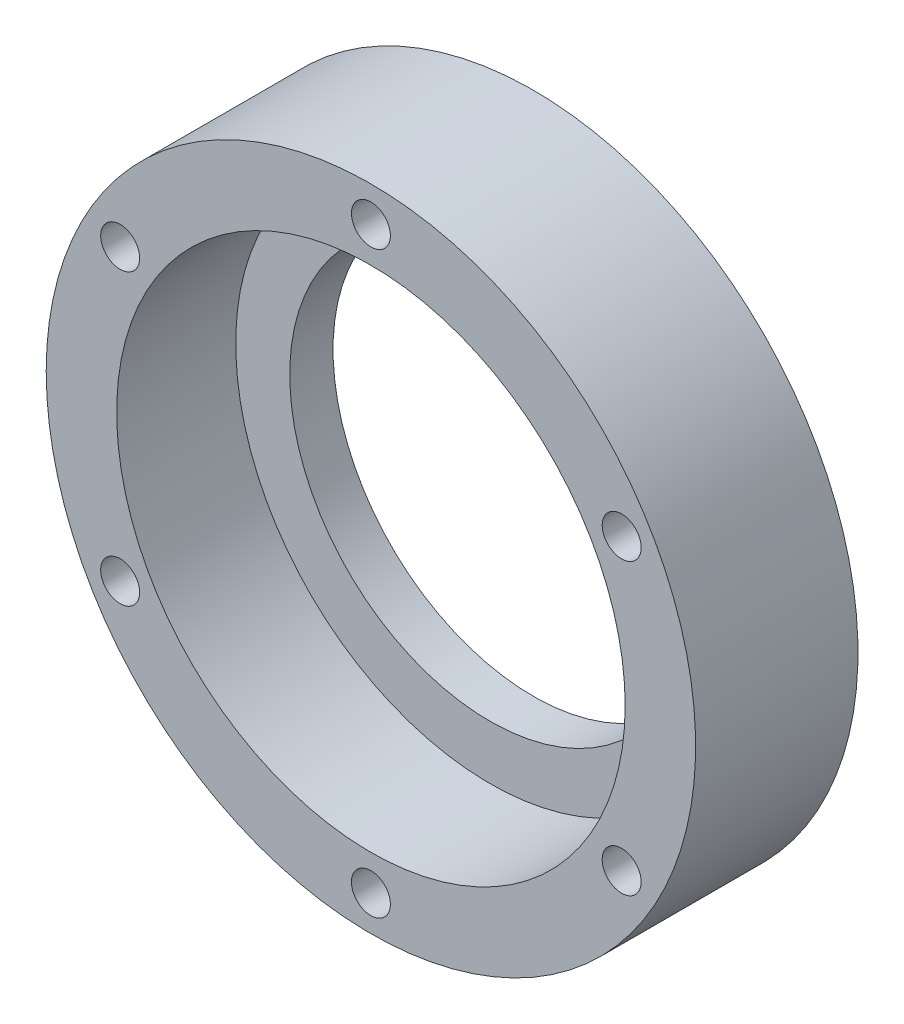
ISO-10303-21;
HEADER;
FILE_DESCRIPTION(('STEP AP214'),'2;1');
FILE_NAME('part.step','',(''),(''),'','','');
FILE_SCHEMA(('AUTOMOTIVE_DESIGN { 1 0 10303 214 1 1 1 1 }'));
ENDSEC;
DATA;
#1=APPLICATION_CONTEXT('core data for automotive mechanical design processes');
#2=APPLICATION_PROTOCOL_DEFINITION('international standard','automotive_design',2000,#1);
#3=PRODUCT_CONTEXT('',#1,'mechanical');
#4=PRODUCT('Part','Part','',(#3));
#5=PRODUCT_RELATED_PRODUCT_CATEGORY('part','',(#4));
#6=PRODUCT_DEFINITION_FORMATION('','',#4);
#7=PRODUCT_DEFINITION_CONTEXT('part definition',#1,'design');
#8=PRODUCT_DEFINITION('design','',#6,#7);
#9=PRODUCT_DEFINITION_SHAPE('','',#8);
#10=(LENGTH_UNIT() NAMED_UNIT(*) SI_UNIT(.MILLI.,.METRE.));
#11=(NAMED_UNIT(*) PLANE_ANGLE_UNIT() SI_UNIT($,.RADIAN.));
#12=(NAMED_UNIT(*) SI_UNIT($,.STERADIAN.) SOLID_ANGLE_UNIT());
#13=UNCERTAINTY_MEASURE_WITH_UNIT(LENGTH_MEASURE(1.E-05),#10,'distance_accuracy_value','');
#14=(GEOMETRIC_REPRESENTATION_CONTEXT(3) GLOBAL_UNCERTAINTY_ASSIGNED_CONTEXT((#13)) GLOBAL_UNIT_ASSIGNED_CONTEXT((#10,
#11,#12)) REPRESENTATION_CONTEXT('',''));
#15=CARTESIAN_POINT('',(0.,0.,0.));
#16=DIRECTION('',(0.,0.,1.));
#17=DIRECTION('',(1.,0.,0.));
#18=AXIS2_PLACEMENT_3D('',#15,#16,#17);
#19=CARTESIAN_POINT('',(0.,0.,15.));
#20=DIRECTION('',(0.,0.,-1.));
#21=DIRECTION('',(-1.,0.,0.));
#22=AXIS2_PLACEMENT_3D('',#19,#20,#21);
#23=CYLINDRICAL_SURFACE('',#22,30.);
#24=CARTESIAN_POINT('',(0.,0.,15.));
#25=DIRECTION('',(0.,0.,-1.));
#26=DIRECTION('',(-1.,0.,0.));
#27=AXIS2_PLACEMENT_3D('',#24,#25,#26);
#28=CIRCLE('',#27,30.);
#29=CARTESIAN_POINT('',(-30.,0.,15.));
#30=VERTEX_POINT('',#29);
#31=EDGE_CURVE('E10',#30,#30,#28,.T.);
#32=ORIENTED_EDGE('',*,*,#31,.T.);
#33=EDGE_LOOP('',(#32));
#34=FACE_BOUND('',#33,.T.);
#35=CARTESIAN_POINT('',(0.,0.,0.));
#36=DIRECTION('',(0.,0.,-1.));
#37=DIRECTION('',(-1.,0.,0.));
#38=AXIS2_PLACEMENT_3D('',#35,#36,#37);
#39=CIRCLE('',#38,30.);
#40=CARTESIAN_POINT('',(-30.,0.,0.));
#41=VERTEX_POINT('',#40);
#42=EDGE_CURVE('E43',#41,#41,#39,.T.);
#43=ORIENTED_EDGE('',*,*,#42,.F.);
#44=EDGE_LOOP('',(#43));
#45=FACE_BOUND('',#44,.T.);
#46=ADVANCED_FACE('F36',(#34,#45),#23,.T.);
#47=CARTESIAN_POINT('',(30.,0.,15.));
#48=DIRECTION('',(0.,0.,1.));
#49=DIRECTION('',(1.,0.,0.));
#50=AXIS2_PLACEMENT_3D('',#47,#48,#49);
#51=PLANE('',#50);
#52=CARTESIAN_POINT('',(0.,0.,15.));
#53=DIRECTION('',(0.,0.,1.));
#54=DIRECTION('',(1.,0.,0.));
#55=AXIS2_PLACEMENT_3D('',#52,#53,#54);
#56=CIRCLE('',#55,23.49119);
#57=CARTESIAN_POINT('',(23.49119,0.,15.));
#58=VERTEX_POINT('',#57);
#59=EDGE_CURVE('E135',#58,#58,#56,.T.);
#60=ORIENTED_EDGE('',*,*,#59,.F.);
#61=EDGE_LOOP('',(#60));
#62=FACE_BOUND('',#61,.T.);
#63=CARTESIAN_POINT('',(-23.1661795512315,-13.3750000000013,15.));
#64=DIRECTION('',(0.,0.,-1.));
#65=DIRECTION('',(-1.,0.,0.));
#66=AXIS2_PLACEMENT_3D('',#63,#64,#65);
#67=CIRCLE('',#66,1.8);
#68=CARTESIAN_POINT('',(-24.9661795512315,-13.3750000000013,15.));
#69=VERTEX_POINT('',#68);
#70=EDGE_CURVE('E112',#69,#69,#67,.T.);
#71=ORIENTED_EDGE('',*,*,#70,.T.);
#72=EDGE_LOOP('',(#71));
#73=FACE_BOUND('',#72,.T.);
#74=CARTESIAN_POINT('',(-23.166179551233,13.3749999999987,15.));
#75=DIRECTION('',(0.,0.,-1.));
#76=DIRECTION('',(-1.,0.,0.));
#77=AXIS2_PLACEMENT_3D('',#74,#75,#76);
#78=CIRCLE('',#77,1.8);
#79=CARTESIAN_POINT('',(-24.966179551233,13.3749999999987,15.));
#80=VERTEX_POINT('',#79);
#81=EDGE_CURVE('E100',#80,#80,#78,.T.);
#82=ORIENTED_EDGE('',*,*,#81,.T.);
#83=EDGE_LOOP('',(#82));
#84=FACE_BOUND('',#83,.T.);
#85=CARTESIAN_POINT('',(3.03457104867779E-12,-26.75,15.));
#86=DIRECTION('',(0.,0.,-1.));
#87=DIRECTION('',(-1.,0.,0.));
#88=AXIS2_PLACEMENT_3D('',#85,#86,#87);
#89=CIRCLE('',#88,1.8);
#90=CARTESIAN_POINT('',(-1.79999999999696,-26.75,15.));
#91=VERTEX_POINT('',#90);
#92=EDGE_CURVE('E88',#91,#91,#89,.T.);
#93=ORIENTED_EDGE('',*,*,#92,.T.);
#94=EDGE_LOOP('',(#93));
#95=FACE_BOUND('',#94,.T.);
#96=CARTESIAN_POINT('',(23.1661795512345,13.3750000000013,15.));
#97=DIRECTION('',(0.,0.,-1.));
#98=DIRECTION('',(-1.,0.,0.));
#99=AXIS2_PLACEMENT_3D('',#96,#97,#98);
#100=CIRCLE('',#99,1.8);
#101=CARTESIAN_POINT('',(21.3661795512345,13.3750000000013,15.));
#102=VERTEX_POINT('',#101);
#103=EDGE_CURVE('E77',#102,#102,#100,.T.);
#104=ORIENTED_EDGE('',*,*,#103,.T.);
#105=EDGE_LOOP('',(#104));
#106=FACE_BOUND('',#105,.T.);
#107=CARTESIAN_POINT('',(23.166179551236,-13.3749999999987,15.));
#108=DIRECTION('',(0.,0.,-1.));
#109=DIRECTION('',(-1.,0.,0.));
#110=AXIS2_PLACEMENT_3D('',#107,#108,#109);
#111=CIRCLE('',#110,1.8);
#112=CARTESIAN_POINT('',(21.366179551236,-13.3749999999987,15.));
#113=VERTEX_POINT('',#112);
#114=EDGE_CURVE('E66',#113,#113,#111,.T.);
#115=ORIENTED_EDGE('',*,*,#114,.T.);
#116=EDGE_LOOP('',(#115));
#117=FACE_BOUND('',#116,.T.);
#118=CARTESIAN_POINT('',(0.,26.75,15.));
#119=DIRECTION('',(0.,0.,-1.));
#120=DIRECTION('',(-1.,0.,0.));
#121=AXIS2_PLACEMENT_3D('',#118,#119,#120);
#122=CIRCLE('',#121,1.8);
#123=CARTESIAN_POINT('',(-1.8,26.75,15.));
#124=VERTEX_POINT('',#123);
#125=EDGE_CURVE('E50',#124,#124,#122,.T.);
#126=ORIENTED_EDGE('',*,*,#125,.T.);
#127=EDGE_LOOP('',(#126));
#128=FACE_BOUND('',#127,.T.);
#129=ORIENTED_EDGE('',*,*,#31,.F.);
#130=EDGE_LOOP('',(#129));
#131=FACE_BOUND('',#130,.T.);
#132=ADVANCED_FACE('F142',(#62,#73,#84,#95,#106,#117,#128,#131),#51,.T.);
#133=CARTESIAN_POINT('',(0.,0.,0.));
#134=DIRECTION('',(0.,0.,-1.));
#135=DIRECTION('',(-1.,0.,0.));
#136=AXIS2_PLACEMENT_3D('',#133,#134,#135);
#137=PLANE('',#136);
#138=CARTESIAN_POINT('',(0.,0.,0.));
#139=DIRECTION('',(0.,0.,1.));
#140=DIRECTION('',(1.,0.,0.));
#141=AXIS2_PLACEMENT_3D('',#138,#139,#140);
#142=CIRCLE('',#141,18.5);
#143=CARTESIAN_POINT('',(18.5,0.,0.));
#144=VERTEX_POINT('',#143);
#145=EDGE_CURVE('E124',#144,#144,#142,.T.);
#146=ORIENTED_EDGE('',*,*,#145,.T.);
#147=EDGE_LOOP('',(#146));
#148=FACE_BOUND('',#147,.T.);
#149=CARTESIAN_POINT('',(-23.1661795512315,-13.3750000000013,0.));
#150=DIRECTION('',(0.,0.,-1.));
#151=DIRECTION('',(-1.,0.,0.));
#152=AXIS2_PLACEMENT_3D('',#149,#150,#151);
#153=CIRCLE('',#152,3.15);
#154=CARTESIAN_POINT('',(-26.3161795512315,-13.3750000000013,0.));
#155=VERTEX_POINT('',#154);
#156=EDGE_CURVE('E120',#155,#155,#153,.T.);
#157=ORIENTED_EDGE('',*,*,#156,.F.);
#158=EDGE_LOOP('',(#157));
#159=FACE_BOUND('',#158,.T.);
#160=CARTESIAN_POINT('',(-23.166179551233,13.3749999999987,0.));
#161=DIRECTION('',(0.,0.,-1.));
#162=DIRECTION('',(-1.,0.,0.));
#163=AXIS2_PLACEMENT_3D('',#160,#161,#162);
#164=CIRCLE('',#163,3.15);
#165=CARTESIAN_POINT('',(-26.316179551233,13.3749999999987,0.));
#166=VERTEX_POINT('',#165);
#167=EDGE_CURVE('E108',#166,#166,#164,.T.);
#168=ORIENTED_EDGE('',*,*,#167,.F.);
#169=EDGE_LOOP('',(#168));
#170=FACE_BOUND('',#169,.T.);
#171=CARTESIAN_POINT('',(3.03457104867779E-12,-26.75,0.));
#172=DIRECTION('',(0.,0.,-1.));
#173=DIRECTION('',(-1.,0.,0.));
#174=AXIS2_PLACEMENT_3D('',#171,#172,#173);
#175=CIRCLE('',#174,3.15);
#176=CARTESIAN_POINT('',(-3.14999999999697,-26.75,0.));
#177=VERTEX_POINT('',#176);
#178=EDGE_CURVE('E96',#177,#177,#175,.T.);
#179=ORIENTED_EDGE('',*,*,#178,.F.);
#180=EDGE_LOOP('',(#179));
#181=FACE_BOUND('',#180,.T.);
#182=CARTESIAN_POINT('',(23.1661795512345,13.3750000000013,0.));
#183=DIRECTION('',(0.,0.,-1.));
#184=DIRECTION('',(-1.,0.,0.));
#185=AXIS2_PLACEMENT_3D('',#182,#183,#184);
#186=CIRCLE('',#185,3.15);
#187=CARTESIAN_POINT('',(20.0161795512345,13.3750000000013,0.));
#188=VERTEX_POINT('',#187);
#189=EDGE_CURVE('E84',#188,#188,#186,.T.);
#190=ORIENTED_EDGE('',*,*,#189,.F.);
#191=EDGE_LOOP('',(#190));
#192=FACE_BOUND('',#191,.T.);
#193=CARTESIAN_POINT('',(23.166179551236,-13.3749999999987,0.));
#194=DIRECTION('',(0.,0.,-1.));
#195=DIRECTION('',(-1.,0.,0.));
#196=AXIS2_PLACEMENT_3D('',#193,#194,#195);
#197=CIRCLE('',#196,3.15);
#198=CARTESIAN_POINT('',(20.016179551236,-13.3749999999987,0.));
#199=VERTEX_POINT('',#198);
#200=EDGE_CURVE('E73',#199,#199,#197,.T.);
#201=ORIENTED_EDGE('',*,*,#200,.F.);
#202=EDGE_LOOP('',(#201));
#203=FACE_BOUND('',#202,.T.);
#204=CARTESIAN_POINT('',(0.,26.75,0.));
#205=DIRECTION('',(0.,0.,-1.));
#206=DIRECTION('',(-1.,0.,0.));
#207=AXIS2_PLACEMENT_3D('',#204,#205,#206);
#208=CIRCLE('',#207,3.15);
#209=CARTESIAN_POINT('',(-3.15,26.75,0.));
#210=VERTEX_POINT('',#209);
#211=EDGE_CURVE('E62',#210,#210,#208,.T.);
#212=ORIENTED_EDGE('',*,*,#211,.F.);
#213=EDGE_LOOP('',(#212));
#214=FACE_BOUND('',#213,.T.);
#215=ORIENTED_EDGE('',*,*,#42,.T.);
#216=EDGE_LOOP('',(#215));
#217=FACE_BOUND('',#216,.T.);
#218=ADVANCED_FACE('F145',(#148,#159,#170,#181,#192,#203,#214,#217),#137,.T.);
#219=CARTESIAN_POINT('',(0.,26.75,0.));
#220=DIRECTION('',(0.,0.,-1.));
#221=DIRECTION('',(-1.,0.,0.));
#222=AXIS2_PLACEMENT_3D('',#219,#220,#221);
#223=CYLINDRICAL_SURFACE('',#222,1.8);
#224=ORIENTED_EDGE('',*,*,#125,.F.);
#225=EDGE_LOOP('',(#224));
#226=FACE_BOUND('',#225,.T.);
#227=CARTESIAN_POINT('',(0.,26.75,1.35));
#228=DIRECTION('',(0.,0.,-1.));
#229=DIRECTION('',(-1.,0.,0.));
#230=AXIS2_PLACEMENT_3D('',#227,#228,#229);
#231=CIRCLE('',#230,1.8);
#232=CARTESIAN_POINT('',(-1.8,26.75,1.35));
#233=VERTEX_POINT('',#232);
#234=EDGE_CURVE('E56',#233,#233,#231,.T.);
#235=ORIENTED_EDGE('',*,*,#234,.T.);
#236=EDGE_LOOP('',(#235));
#237=FACE_BOUND('',#236,.T.);
#238=ADVANCED_FACE('F159',(#226,#237),#223,.F.);
#239=CARTESIAN_POINT('',(0.,26.75,0.));
#240=DIRECTION('',(0.,0.,-1.));
#241=DIRECTION('',(-1.,0.,0.));
#242=AXIS2_PLACEMENT_3D('',#239,#240,#241);
#243=CONICAL_SURFACE('',#242,3.15,0.785398163397449);
#244=ORIENTED_EDGE('',*,*,#234,.F.);
#245=EDGE_LOOP('',(#244));
#246=FACE_BOUND('',#245,.T.);
#247=ORIENTED_EDGE('',*,*,#211,.T.);
#248=EDGE_LOOP('',(#247));
#249=FACE_BOUND('',#248,.T.);
#250=ADVANCED_FACE('F162',(#246,#249),#243,.F.);
#251=CARTESIAN_POINT('',(23.166179551236,-13.3749999999987,0.));
#252=DIRECTION('',(0.,0.,-1.));
#253=DIRECTION('',(-1.,0.,0.));
#254=AXIS2_PLACEMENT_3D('',#251,#252,#253);
#255=CYLINDRICAL_SURFACE('',#254,1.8);
#256=ORIENTED_EDGE('',*,*,#114,.F.);
#257=EDGE_LOOP('',(#256));
#258=FACE_BOUND('',#257,.T.);
#259=CARTESIAN_POINT('',(23.166179551236,-13.3749999999987,1.35));
#260=DIRECTION('',(0.,0.,-1.));
#261=DIRECTION('',(-1.,0.,0.));
#262=AXIS2_PLACEMENT_3D('',#259,#260,#261);
#263=CIRCLE('',#262,1.8);
#264=CARTESIAN_POINT('',(21.366179551236,-13.3749999999987,1.35));
#265=VERTEX_POINT('',#264);
#266=EDGE_CURVE('E70',#265,#265,#263,.T.);
#267=ORIENTED_EDGE('',*,*,#266,.T.);
#268=EDGE_LOOP('',(#267));
#269=FACE_BOUND('',#268,.T.);
#270=ADVANCED_FACE('F168',(#258,#269),#255,.F.);
#271=CARTESIAN_POINT('',(23.166179551236,-13.3749999999987,0.));
#272=DIRECTION('',(0.,0.,-1.));
#273=DIRECTION('',(-1.,0.,0.));
#274=AXIS2_PLACEMENT_3D('',#271,#272,#273);
#275=CONICAL_SURFACE('',#274,3.15,0.785398163397449);
#276=ORIENTED_EDGE('',*,*,#266,.F.);
#277=EDGE_LOOP('',(#276));
#278=FACE_BOUND('',#277,.T.);
#279=ORIENTED_EDGE('',*,*,#200,.T.);
#280=EDGE_LOOP('',(#279));
#281=FACE_BOUND('',#280,.T.);
#282=ADVANCED_FACE('F207',(#278,#281),#275,.F.);
#283=CARTESIAN_POINT('',(23.1661795512345,13.3750000000013,0.));
#284=DIRECTION('',(0.,0.,-1.));
#285=DIRECTION('',(-1.,0.,0.));
#286=AXIS2_PLACEMENT_3D('',#283,#284,#285);
#287=CYLINDRICAL_SURFACE('',#286,1.8);
#288=ORIENTED_EDGE('',*,*,#103,.F.);
#289=EDGE_LOOP('',(#288));
#290=FACE_BOUND('',#289,.T.);
#291=CARTESIAN_POINT('',(23.1661795512345,13.3750000000013,1.35));
#292=DIRECTION('',(0.,0.,-1.));
#293=DIRECTION('',(-1.,0.,0.));
#294=AXIS2_PLACEMENT_3D('',#291,#292,#293);
#295=CIRCLE('',#294,1.8);
#296=CARTESIAN_POINT('',(21.3661795512345,13.3750000000013,1.35));
#297=VERTEX_POINT('',#296);
#298=EDGE_CURVE('E81',#297,#297,#295,.T.);
#299=ORIENTED_EDGE('',*,*,#298,.T.);
#300=EDGE_LOOP('',(#299));
#301=FACE_BOUND('',#300,.T.);
#302=ADVANCED_FACE('F216',(#290,#301),#287,.F.);
#303=CARTESIAN_POINT('',(23.1661795512345,13.3750000000013,0.));
#304=DIRECTION('',(0.,0.,-1.));
#305=DIRECTION('',(-1.,0.,0.));
#306=AXIS2_PLACEMENT_3D('',#303,#304,#305);
#307=CONICAL_SURFACE('',#306,3.15,0.785398163397449);
#308=ORIENTED_EDGE('',*,*,#298,.F.);
#309=EDGE_LOOP('',(#308));
#310=FACE_BOUND('',#309,.T.);
#311=ORIENTED_EDGE('',*,*,#189,.T.);
#312=EDGE_LOOP('',(#311));
#313=FACE_BOUND('',#312,.T.);
#314=ADVANCED_FACE('F225',(#310,#313),#307,.F.);
#315=CARTESIAN_POINT('',(3.03457104867779E-12,-26.75,0.));
#316=DIRECTION('',(0.,0.,-1.));
#317=DIRECTION('',(-1.,0.,0.));
#318=AXIS2_PLACEMENT_3D('',#315,#316,#317);
#319=CYLINDRICAL_SURFACE('',#318,1.8);
#320=ORIENTED_EDGE('',*,*,#92,.F.);
#321=EDGE_LOOP('',(#320));
#322=FACE_BOUND('',#321,.T.);
#323=CARTESIAN_POINT('',(3.03457104867779E-12,-26.75,1.35));
#324=DIRECTION('',(0.,0.,-1.));
#325=DIRECTION('',(-1.,0.,0.));
#326=AXIS2_PLACEMENT_3D('',#323,#324,#325);
#327=CIRCLE('',#326,1.8);
#328=CARTESIAN_POINT('',(-1.79999999999696,-26.75,1.35));
#329=VERTEX_POINT('',#328);
#330=EDGE_CURVE('E92',#329,#329,#327,.T.);
#331=ORIENTED_EDGE('',*,*,#330,.T.);
#332=EDGE_LOOP('',(#331));
#333=FACE_BOUND('',#332,.T.);
#334=ADVANCED_FACE('F234',(#322,#333),#319,.F.);
#335=CARTESIAN_POINT('',(3.03457104867779E-12,-26.75,0.));
#336=DIRECTION('',(0.,0.,-1.));
#337=DIRECTION('',(-1.,0.,0.));
#338=AXIS2_PLACEMENT_3D('',#335,#336,#337);
#339=CONICAL_SURFACE('',#338,3.15,0.785398163397449);
#340=ORIENTED_EDGE('',*,*,#330,.F.);
#341=EDGE_LOOP('',(#340));
#342=FACE_BOUND('',#341,.T.);
#343=ORIENTED_EDGE('',*,*,#178,.T.);
#344=EDGE_LOOP('',(#343));
#345=FACE_BOUND('',#344,.T.);
#346=ADVANCED_FACE('F243',(#342,#345),#339,.F.);
#347=CARTESIAN_POINT('',(-23.166179551233,13.3749999999987,0.));
#348=DIRECTION('',(0.,0.,-1.));
#349=DIRECTION('',(-1.,0.,0.));
#350=AXIS2_PLACEMENT_3D('',#347,#348,#349);
#351=CYLINDRICAL_SURFACE('',#350,1.8);
#352=ORIENTED_EDGE('',*,*,#81,.F.);
#353=EDGE_LOOP('',(#352));
#354=FACE_BOUND('',#353,.T.);
#355=CARTESIAN_POINT('',(-23.166179551233,13.3749999999987,1.35));
#356=DIRECTION('',(0.,0.,-1.));
#357=DIRECTION('',(-1.,0.,0.));
#358=AXIS2_PLACEMENT_3D('',#355,#356,#357);
#359=CIRCLE('',#358,1.8);
#360=CARTESIAN_POINT('',(-24.966179551233,13.3749999999987,1.35));
#361=VERTEX_POINT('',#360);
#362=EDGE_CURVE('E104',#361,#361,#359,.T.);
#363=ORIENTED_EDGE('',*,*,#362,.T.);
#364=EDGE_LOOP('',(#363));
#365=FACE_BOUND('',#364,.T.);
#366=ADVANCED_FACE('F252',(#354,#365),#351,.F.);
#367=CARTESIAN_POINT('',(-23.166179551233,13.3749999999987,0.));
#368=DIRECTION('',(0.,0.,-1.));
#369=DIRECTION('',(-1.,0.,0.));
#370=AXIS2_PLACEMENT_3D('',#367,#368,#369);
#371=CONICAL_SURFACE('',#370,3.15,0.785398163397449);
#372=ORIENTED_EDGE('',*,*,#362,.F.);
#373=EDGE_LOOP('',(#372));
#374=FACE_BOUND('',#373,.T.);
#375=ORIENTED_EDGE('',*,*,#167,.T.);
#376=EDGE_LOOP('',(#375));
#377=FACE_BOUND('',#376,.T.);
#378=ADVANCED_FACE('F261',(#374,#377),#371,.F.);
#379=CARTESIAN_POINT('',(-23.1661795512315,-13.3750000000013,0.));
#380=DIRECTION('',(0.,0.,-1.));
#381=DIRECTION('',(-1.,0.,0.));
#382=AXIS2_PLACEMENT_3D('',#379,#380,#381);
#383=CYLINDRICAL_SURFACE('',#382,1.8);
#384=ORIENTED_EDGE('',*,*,#70,.F.);
#385=EDGE_LOOP('',(#384));
#386=FACE_BOUND('',#385,.T.);
#387=CARTESIAN_POINT('',(-23.1661795512315,-13.3750000000013,1.35));
#388=DIRECTION('',(0.,0.,-1.));
#389=DIRECTION('',(-1.,0.,0.));
#390=AXIS2_PLACEMENT_3D('',#387,#388,#389);
#391=CIRCLE('',#390,1.8);
#392=CARTESIAN_POINT('',(-24.9661795512315,-13.3750000000013,1.35));
#393=VERTEX_POINT('',#392);
#394=EDGE_CURVE('E116',#393,#393,#391,.T.);
#395=ORIENTED_EDGE('',*,*,#394,.T.);
#396=EDGE_LOOP('',(#395));
#397=FACE_BOUND('',#396,.T.);
#398=ADVANCED_FACE('F270',(#386,#397),#383,.F.);
#399=CARTESIAN_POINT('',(-23.1661795512315,-13.3750000000013,0.));
#400=DIRECTION('',(0.,0.,-1.));
#401=DIRECTION('',(-1.,0.,0.));
#402=AXIS2_PLACEMENT_3D('',#399,#400,#401);
#403=CONICAL_SURFACE('',#402,3.15,0.785398163397449);
#404=ORIENTED_EDGE('',*,*,#394,.F.);
#405=EDGE_LOOP('',(#404));
#406=FACE_BOUND('',#405,.T.);
#407=ORIENTED_EDGE('',*,*,#156,.T.);
#408=EDGE_LOOP('',(#407));
#409=FACE_BOUND('',#408,.T.);
#410=ADVANCED_FACE('F279',(#406,#409),#403,.F.);
#411=CARTESIAN_POINT('',(0.,0.,15.));
#412=DIRECTION('',(0.,0.,1.));
#413=DIRECTION('',(1.,0.,0.));
#414=AXIS2_PLACEMENT_3D('',#411,#412,#413);
#415=CYLINDRICAL_SURFACE('',#414,18.5);
#416=ORIENTED_EDGE('',*,*,#145,.F.);
#417=EDGE_LOOP('',(#416));
#418=FACE_BOUND('',#417,.T.);
#419=CARTESIAN_POINT('',(0.,0.,4.));
#420=DIRECTION('',(0.,0.,1.));
#421=DIRECTION('',(1.,0.,0.));
#422=AXIS2_PLACEMENT_3D('',#419,#420,#421);
#423=CIRCLE('',#422,18.5);
#424=CARTESIAN_POINT('',(18.5,0.,4.));
#425=VERTEX_POINT('',#424);
#426=EDGE_CURVE('E127',#425,#425,#423,.T.);
#427=ORIENTED_EDGE('',*,*,#426,.T.);
#428=EDGE_LOOP('',(#427));
#429=FACE_BOUND('',#428,.T.);
#430=ADVANCED_FACE('F287',(#418,#429),#415,.F.);
#431=CARTESIAN_POINT('',(18.5,0.,4.));
#432=DIRECTION('',(0.,0.,-1.));
#433=DIRECTION('',(-1.,0.,0.));
#434=AXIS2_PLACEMENT_3D('',#431,#432,#433);
#435=PLANE('',#434);
#436=ORIENTED_EDGE('',*,*,#426,.F.);
#437=EDGE_LOOP('',(#436));
#438=FACE_BOUND('',#437,.T.);
#439=CARTESIAN_POINT('',(0.,0.,4.));
#440=DIRECTION('',(0.,0.,1.));
#441=DIRECTION('',(1.,0.,0.));
#442=AXIS2_PLACEMENT_3D('',#439,#440,#441);
#443=CIRCLE('',#442,23.49119);
#444=CARTESIAN_POINT('',(23.49119,0.,4.));
#445=VERTEX_POINT('',#444);
#446=EDGE_CURVE('E131',#445,#445,#443,.T.);
#447=ORIENTED_EDGE('',*,*,#446,.T.);
#448=EDGE_LOOP('',(#447));
#449=FACE_BOUND('',#448,.T.);
#450=ADVANCED_FACE('F295',(#438,#449),#435,.F.);
#451=CARTESIAN_POINT('',(0.,0.,15.));
#452=DIRECTION('',(0.,0.,1.));
#453=DIRECTION('',(1.,0.,0.));
#454=AXIS2_PLACEMENT_3D('',#451,#452,#453);
#455=CYLINDRICAL_SURFACE('',#454,23.49119);
#456=ORIENTED_EDGE('',*,*,#446,.F.);
#457=EDGE_LOOP('',(#456));
#458=FACE_BOUND('',#457,.T.);
#459=ORIENTED_EDGE('',*,*,#59,.T.);
#460=EDGE_LOOP('',(#459));
#461=FACE_BOUND('',#460,.T.);
#462=ADVANCED_FACE('F140',(#458,#461),#455,.F.);
#463=CLOSED_SHELL('',(#46,#132,#218,#238,#250,#270,#282,#302,#314,#334,#346,#366,#378,#398,#410,
#430,#450,#462));
#464=MANIFOLD_SOLID_BREP('B2',#463);
#465=ADVANCED_BREP_SHAPE_REPRESENTATION('',(#18,#464),#14);
#466=SHAPE_DEFINITION_REPRESENTATION(#9,#465);
ENDSEC;
END-ISO-10303-21;
